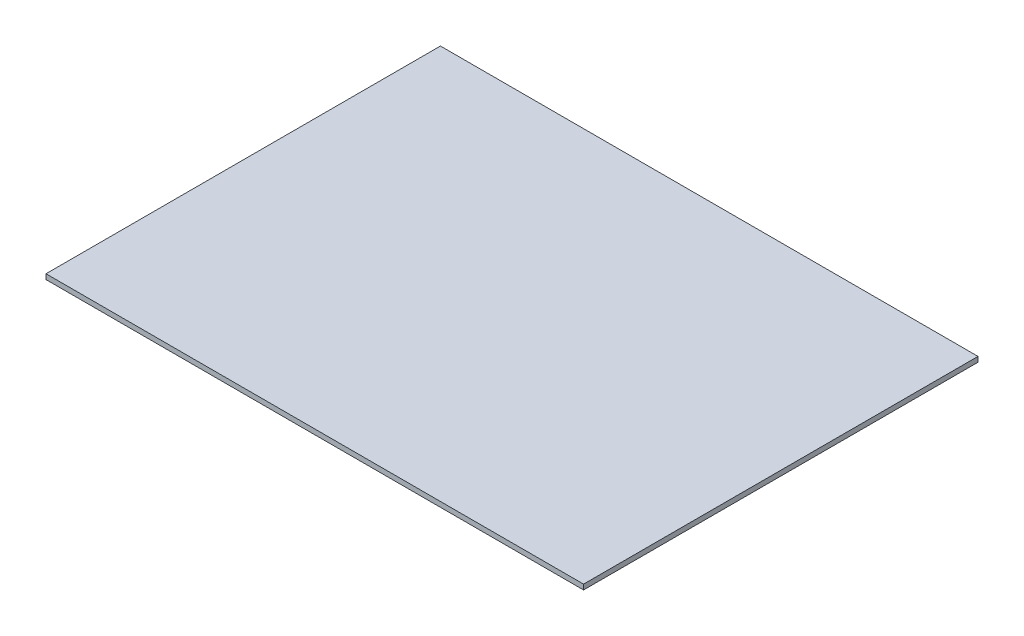
ISO-10303-21;
HEADER;
FILE_DESCRIPTION(('STEP AP214'),'2;1');
FILE_NAME('part.step','',(''),(''),'','','');
FILE_SCHEMA(('AUTOMOTIVE_DESIGN { 1 0 10303 214 1 1 1 1 }'));
ENDSEC;
DATA;
#1=APPLICATION_CONTEXT('core data for automotive mechanical design processes');
#2=APPLICATION_PROTOCOL_DEFINITION('international standard','automotive_design',2000,#1);
#3=PRODUCT_CONTEXT('',#1,'mechanical');
#4=PRODUCT('Part','Part','',(#3));
#5=PRODUCT_RELATED_PRODUCT_CATEGORY('part','',(#4));
#6=PRODUCT_DEFINITION_FORMATION('','',#4);
#7=PRODUCT_DEFINITION_CONTEXT('part definition',#1,'design');
#8=PRODUCT_DEFINITION('design','',#6,#7);
#9=PRODUCT_DEFINITION_SHAPE('','',#8);
#10=(LENGTH_UNIT() NAMED_UNIT(*) SI_UNIT(.MILLI.,.METRE.));
#11=(NAMED_UNIT(*) PLANE_ANGLE_UNIT() SI_UNIT($,.RADIAN.));
#12=(NAMED_UNIT(*) SI_UNIT($,.STERADIAN.) SOLID_ANGLE_UNIT());
#13=UNCERTAINTY_MEASURE_WITH_UNIT(LENGTH_MEASURE(1.E-05),#10,'distance_accuracy_value','');
#14=(GEOMETRIC_REPRESENTATION_CONTEXT(3) GLOBAL_UNCERTAINTY_ASSIGNED_CONTEXT((#13)) GLOBAL_UNIT_ASSIGNED_CONTEXT((#10,
#11,#12)) REPRESENTATION_CONTEXT('',''));
#15=CARTESIAN_POINT('',(0.,0.,0.));
#16=DIRECTION('',(0.,0.,1.));
#17=DIRECTION('',(1.,0.,0.));
#18=AXIS2_PLACEMENT_3D('',#15,#16,#17);
#19=CARTESIAN_POINT('',(0.,1.5875,0.));
#20=DIRECTION('',(1.,0.,0.));
#21=DIRECTION('',(0.,0.,-1.));
#22=AXIS2_PLACEMENT_3D('',#19,#20,#21);
#23=PLANE('',#22);
#24=DIRECTION('',(0.,0.,1.));
#25=VECTOR('',#24,1.);
#26=CARTESIAN_POINT('',(0.,0.,0.));
#27=LINE('',#26,#25);
#28=CARTESIAN_POINT('',(0.,0.,-123.));
#29=VERTEX_POINT('',#28);
#30=CARTESIAN_POINT('',(0.,0.,0.));
#31=VERTEX_POINT('',#30);
#32=EDGE_CURVE('E96',#29,#31,#27,.T.);
#33=ORIENTED_EDGE('',*,*,#32,.T.);
#34=DIRECTION('',(0.,-1.,0.));
#35=VECTOR('',#34,1.);
#36=CARTESIAN_POINT('',(0.,1.5875,0.));
#37=LINE('',#36,#35);
#38=CARTESIAN_POINT('',(0.,1.5875,0.));
#39=VERTEX_POINT('',#38);
#40=EDGE_CURVE('E11',#39,#31,#37,.T.);
#41=ORIENTED_EDGE('',*,*,#40,.F.);
#42=DIRECTION('',(0.,0.,1.));
#43=VECTOR('',#42,1.);
#44=CARTESIAN_POINT('',(0.,1.5875,0.));
#45=LINE('',#44,#43);
#46=CARTESIAN_POINT('',(0.,1.5875,-123.));
#47=VERTEX_POINT('',#46);
#48=EDGE_CURVE('E84',#47,#39,#45,.T.);
#49=ORIENTED_EDGE('',*,*,#48,.F.);
#50=DIRECTION('',(0.,-1.,0.));
#51=VECTOR('',#50,1.);
#52=CARTESIAN_POINT('',(0.,1.5875,-123.));
#53=LINE('',#52,#51);
#54=EDGE_CURVE('E92',#47,#29,#53,.T.);
#55=ORIENTED_EDGE('',*,*,#54,.T.);
#56=EDGE_LOOP('',(#33,#41,#49,#55));
#57=FACE_BOUND('',#56,.T.);
#58=ADVANCED_FACE('F33',(#57),#23,.F.);
#59=CARTESIAN_POINT('',(0.,1.5875,0.));
#60=DIRECTION('',(0.,0.,-1.));
#61=DIRECTION('',(-1.,0.,0.));
#62=AXIS2_PLACEMENT_3D('',#59,#60,#61);
#63=PLANE('',#62);
#64=DIRECTION('',(1.,0.,0.));
#65=VECTOR('',#64,1.);
#66=CARTESIAN_POINT('',(0.,0.,0.));
#67=LINE('',#66,#65);
#68=CARTESIAN_POINT('',(167.64,0.,0.));
#69=VERTEX_POINT('',#68);
#70=EDGE_CURVE('E88',#31,#69,#67,.T.);
#71=ORIENTED_EDGE('',*,*,#70,.T.);
#72=DIRECTION('',(0.,-1.,0.));
#73=VECTOR('',#72,1.);
#74=CARTESIAN_POINT('',(167.64,1.5875,0.));
#75=LINE('',#74,#73);
#76=CARTESIAN_POINT('',(167.64,1.5875,0.));
#77=VERTEX_POINT('',#76);
#78=EDGE_CURVE('E41',#77,#69,#75,.T.);
#79=ORIENTED_EDGE('',*,*,#78,.F.);
#80=DIRECTION('',(1.,0.,0.));
#81=VECTOR('',#80,1.);
#82=CARTESIAN_POINT('',(0.,1.5875,0.));
#83=LINE('',#82,#81);
#84=EDGE_CURVE('E79',#39,#77,#83,.T.);
#85=ORIENTED_EDGE('',*,*,#84,.F.);
#86=ORIENTED_EDGE('',*,*,#40,.T.);
#87=EDGE_LOOP('',(#71,#79,#85,#86));
#88=FACE_BOUND('',#87,.T.);
#89=ADVANCED_FACE('F87',(#88),#63,.F.);
#90=CARTESIAN_POINT('',(167.64,1.5875,0.));
#91=DIRECTION('',(-1.,0.,0.));
#92=DIRECTION('',(0.,0.,1.));
#93=AXIS2_PLACEMENT_3D('',#90,#91,#92);
#94=PLANE('',#93);
#95=DIRECTION('',(0.,0.,-1.));
#96=VECTOR('',#95,1.);
#97=CARTESIAN_POINT('',(167.64,0.,0.));
#98=LINE('',#97,#96);
#99=CARTESIAN_POINT('',(167.64,0.,-123.));
#100=VERTEX_POINT('',#99);
#101=EDGE_CURVE('E66',#69,#100,#98,.T.);
#102=ORIENTED_EDGE('',*,*,#101,.T.);
#103=DIRECTION('',(0.,-1.,0.));
#104=VECTOR('',#103,1.);
#105=CARTESIAN_POINT('',(167.64,1.5875,-123.));
#106=LINE('',#105,#104);
#107=CARTESIAN_POINT('',(167.64,1.5875,-123.));
#108=VERTEX_POINT('',#107);
#109=EDGE_CURVE('E89',#108,#100,#106,.T.);
#110=ORIENTED_EDGE('',*,*,#109,.F.);
#111=DIRECTION('',(0.,0.,-1.));
#112=VECTOR('',#111,1.);
#113=CARTESIAN_POINT('',(167.64,1.5875,0.));
#114=LINE('',#113,#112);
#115=EDGE_CURVE('E82',#77,#108,#114,.T.);
#116=ORIENTED_EDGE('',*,*,#115,.F.);
#117=ORIENTED_EDGE('',*,*,#78,.T.);
#118=EDGE_LOOP('',(#102,#110,#116,#117));
#119=FACE_BOUND('',#118,.T.);
#120=ADVANCED_FACE('F90',(#119),#94,.F.);
#121=CARTESIAN_POINT('',(0.,1.5875,-123.));
#122=DIRECTION('',(0.,0.,1.));
#123=DIRECTION('',(1.,0.,0.));
#124=AXIS2_PLACEMENT_3D('',#121,#122,#123);
#125=PLANE('',#124);
#126=DIRECTION('',(-1.,0.,0.));
#127=VECTOR('',#126,1.);
#128=CARTESIAN_POINT('',(0.,0.,-123.));
#129=LINE('',#128,#127);
#130=EDGE_CURVE('E72',#100,#29,#129,.T.);
#131=ORIENTED_EDGE('',*,*,#130,.T.);
#132=ORIENTED_EDGE('',*,*,#54,.F.);
#133=DIRECTION('',(-1.,0.,0.));
#134=VECTOR('',#133,1.);
#135=CARTESIAN_POINT('',(0.,1.5875,-123.));
#136=LINE('',#135,#134);
#137=EDGE_CURVE('E49',#108,#47,#136,.T.);
#138=ORIENTED_EDGE('',*,*,#137,.F.);
#139=ORIENTED_EDGE('',*,*,#109,.T.);
#140=EDGE_LOOP('',(#131,#132,#138,#139));
#141=FACE_BOUND('',#140,.T.);
#142=ADVANCED_FACE('F103',(#141),#125,.F.);
#143=CARTESIAN_POINT('',(0.,1.5875,0.));
#144=DIRECTION('',(0.,-1.,0.));
#145=DIRECTION('',(0.,0.,-1.));
#146=AXIS2_PLACEMENT_3D('',#143,#144,#145);
#147=PLANE('',#146);
#148=ORIENTED_EDGE('',*,*,#48,.T.);
#149=ORIENTED_EDGE('',*,*,#84,.T.);
#150=ORIENTED_EDGE('',*,*,#115,.T.);
#151=ORIENTED_EDGE('',*,*,#137,.T.);
#152=EDGE_LOOP('',(#148,#149,#150,#151));
#153=FACE_BOUND('',#152,.T.);
#154=ADVANCED_FACE('F80',(#153),#147,.F.);
#155=CARTESIAN_POINT('',(0.,0.,0.));
#156=DIRECTION('',(0.,-1.,0.));
#157=DIRECTION('',(0.,0.,-1.));
#158=AXIS2_PLACEMENT_3D('',#155,#156,#157);
#159=PLANE('',#158);
#160=ORIENTED_EDGE('',*,*,#32,.F.);
#161=ORIENTED_EDGE('',*,*,#130,.F.);
#162=ORIENTED_EDGE('',*,*,#101,.F.);
#163=ORIENTED_EDGE('',*,*,#70,.F.);
#164=EDGE_LOOP('',(#160,#161,#162,#163));
#165=FACE_BOUND('',#164,.T.);
#166=ADVANCED_FACE('F106',(#165),#159,.T.);
#167=CLOSED_SHELL('',(#58,#89,#120,#142,#154,#166));
#168=MANIFOLD_SOLID_BREP('B2',#167);
#169=ADVANCED_BREP_SHAPE_REPRESENTATION('',(#18,#168),#14);
#170=SHAPE_DEFINITION_REPRESENTATION(#9,#169);
ENDSEC;
END-ISO-10303-21;
